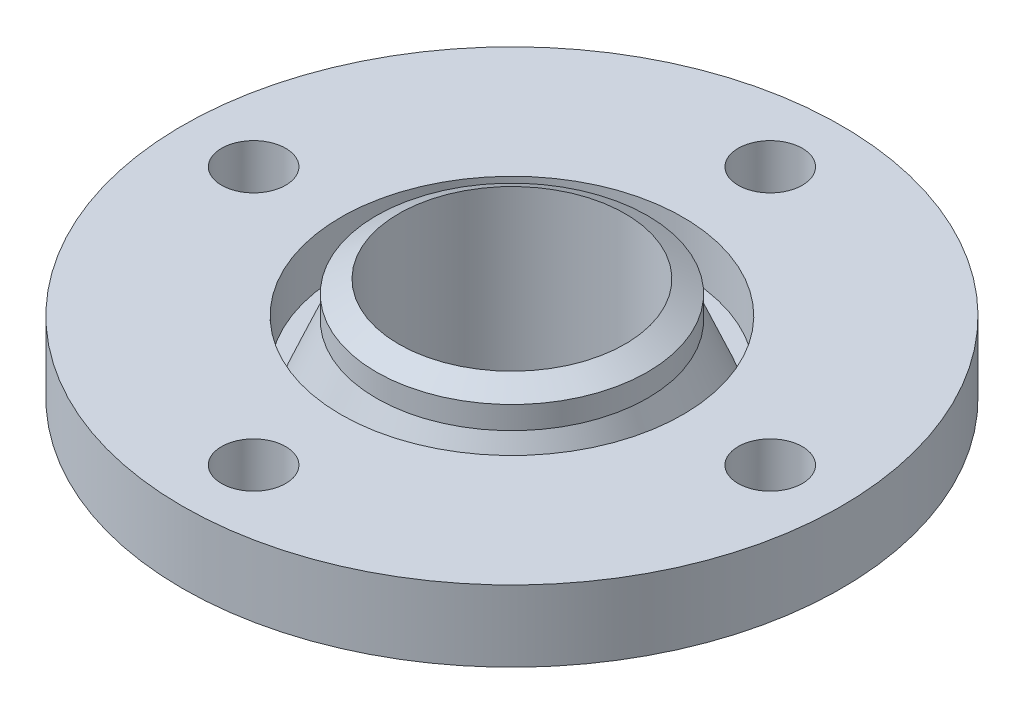
ISO-10303-21;
HEADER;
FILE_DESCRIPTION(('STEP AP214'),'2;1');
FILE_NAME('part.step','',(''),(''),'','','');
FILE_SCHEMA(('AUTOMOTIVE_DESIGN { 1 0 10303 214 1 1 1 1 }'));
ENDSEC;
DATA;
#1=APPLICATION_CONTEXT('core data for automotive mechanical design processes');
#2=APPLICATION_PROTOCOL_DEFINITION('international standard','automotive_design',2000,#1);
#3=PRODUCT_CONTEXT('',#1,'mechanical');
#4=PRODUCT('Part','Part','',(#3));
#5=PRODUCT_RELATED_PRODUCT_CATEGORY('part','',(#4));
#6=PRODUCT_DEFINITION_FORMATION('','',#4);
#7=PRODUCT_DEFINITION_CONTEXT('part definition',#1,'design');
#8=PRODUCT_DEFINITION('design','',#6,#7);
#9=PRODUCT_DEFINITION_SHAPE('','',#8);
#10=(LENGTH_UNIT() NAMED_UNIT(*) SI_UNIT(.MILLI.,.METRE.));
#11=(NAMED_UNIT(*) PLANE_ANGLE_UNIT() SI_UNIT($,.RADIAN.));
#12=(NAMED_UNIT(*) SI_UNIT($,.STERADIAN.) SOLID_ANGLE_UNIT());
#13=UNCERTAINTY_MEASURE_WITH_UNIT(LENGTH_MEASURE(1.E-05),#10,'distance_accuracy_value','');
#14=(GEOMETRIC_REPRESENTATION_CONTEXT(3) GLOBAL_UNCERTAINTY_ASSIGNED_CONTEXT((#13)) GLOBAL_UNIT_ASSIGNED_CONTEXT((#10,
#11,#12)) REPRESENTATION_CONTEXT('',''));
#15=CARTESIAN_POINT('',(0.,0.,0.));
#16=DIRECTION('',(0.,0.,1.));
#17=DIRECTION('',(1.,0.,0.));
#18=AXIS2_PLACEMENT_3D('',#15,#16,#17);
#19=CARTESIAN_POINT('',(0.,0.,0.));
#20=DIRECTION('',(0.,-1.,0.));
#21=DIRECTION('',(0.,0.,-1.));
#22=AXIS2_PLACEMENT_3D('',#19,#20,#21);
#23=CONICAL_SURFACE('',#22,31.75,1.04719755119659);
#24=CARTESIAN_POINT('',(0.,-3.63730669589472,0.));
#25=DIRECTION('',(0.,1.,0.));
#26=DIRECTION('',(0.,0.,1.));
#27=AXIS2_PLACEMENT_3D('',#24,#25,#26);
#28=CIRCLE('',#27,38.05);
#29=CARTESIAN_POINT('',(0.,-3.63730669589472,38.05));
#30=VERTEX_POINT('',#29);
#31=EDGE_CURVE('E10',#30,#30,#28,.T.);
#32=ORIENTED_EDGE('',*,*,#31,.T.);
#33=EDGE_LOOP('',(#32));
#34=FACE_BOUND('',#33,.T.);
#35=CARTESIAN_POINT('',(0.,0.,0.));
#36=DIRECTION('',(0.,1.,0.));
#37=DIRECTION('',(0.,0.,1.));
#38=AXIS2_PLACEMENT_3D('',#35,#36,#37);
#39=CIRCLE('',#38,31.75);
#40=CARTESIAN_POINT('',(0.,0.,31.75));
#41=VERTEX_POINT('',#40);
#42=EDGE_CURVE('E78',#41,#41,#39,.T.);
#43=ORIENTED_EDGE('',*,*,#42,.F.);
#44=EDGE_LOOP('',(#43));
#45=FACE_BOUND('',#44,.T.);
#46=ADVANCED_FACE('F37',(#34,#45),#23,.T.);
#47=CARTESIAN_POINT('',(0.,0.,0.));
#48=DIRECTION('',(0.,1.,0.));
#49=DIRECTION('',(0.,0.,1.));
#50=AXIS2_PLACEMENT_3D('',#47,#48,#49);
#51=CYLINDRICAL_SURFACE('',#50,38.05);
#52=CARTESIAN_POINT('',(0.,-10.,0.));
#53=DIRECTION('',(0.,1.,0.));
#54=DIRECTION('',(0.,0.,1.));
#55=AXIS2_PLACEMENT_3D('',#52,#53,#54);
#56=CIRCLE('',#55,38.05);
#57=CARTESIAN_POINT('',(0.,-10.,38.05));
#58=VERTEX_POINT('',#57);
#59=EDGE_CURVE('E44',#58,#58,#56,.T.);
#60=ORIENTED_EDGE('',*,*,#59,.T.);
#61=EDGE_LOOP('',(#60));
#62=FACE_BOUND('',#61,.T.);
#63=ORIENTED_EDGE('',*,*,#31,.F.);
#64=EDGE_LOOP('',(#63));
#65=FACE_BOUND('',#64,.T.);
#66=ADVANCED_FACE('F122',(#62,#65),#51,.T.);
#67=CARTESIAN_POINT('',(0.,-10.,0.));
#68=DIRECTION('',(0.,-1.,0.));
#69=DIRECTION('',(0.,0.,-1.));
#70=AXIS2_PLACEMENT_3D('',#67,#68,#69);
#71=CONICAL_SURFACE('',#70,38.05,0.396285049494058);
#72=CARTESIAN_POINT('',(0.,-29.,0.));
#73=DIRECTION('',(0.,1.,0.));
#74=DIRECTION('',(0.,0.,1.));
#75=AXIS2_PLACEMENT_3D('',#72,#73,#74);
#76=CIRCLE('',#75,46.);
#77=CARTESIAN_POINT('',(0.,-29.,46.));
#78=VERTEX_POINT('',#77);
#79=EDGE_CURVE('E49',#78,#78,#76,.T.);
#80=ORIENTED_EDGE('',*,*,#79,.T.);
#81=EDGE_LOOP('',(#80));
#82=FACE_BOUND('',#81,.T.);
#83=ORIENTED_EDGE('',*,*,#59,.F.);
#84=EDGE_LOOP('',(#83));
#85=FACE_BOUND('',#84,.T.);
#86=ADVANCED_FACE('F107',(#82,#85),#71,.T.);
#87=CARTESIAN_POINT('',(-54.,-29.,0.));
#88=DIRECTION('',(0.,1.,0.));
#89=DIRECTION('',(0.,0.,1.));
#90=AXIS2_PLACEMENT_3D('',#87,#88,#89);
#91=PLANE('',#90);
#92=CARTESIAN_POINT('',(0.,-29.,0.));
#93=DIRECTION('',(0.,1.,0.));
#94=DIRECTION('',(0.,0.,1.));
#95=AXIS2_PLACEMENT_3D('',#92,#93,#94);
#96=CIRCLE('',#95,54.);
#97=CARTESIAN_POINT('',(0.,-29.,54.));
#98=VERTEX_POINT('',#97);
#99=EDGE_CURVE('E102',#98,#98,#96,.T.);
#100=ORIENTED_EDGE('',*,*,#99,.T.);
#101=EDGE_LOOP('',(#100));
#102=FACE_BOUND('',#101,.T.);
#103=ORIENTED_EDGE('',*,*,#79,.F.);
#104=EDGE_LOOP('',(#103));
#105=FACE_BOUND('',#104,.T.);
#106=ADVANCED_FACE('F110',(#102,#105),#91,.T.);
#107=CARTESIAN_POINT('',(0.,-29.,0.));
#108=DIRECTION('',(0.,-1.,0.));
#109=DIRECTION('',(0.,0.,-1.));
#110=AXIS2_PLACEMENT_3D('',#107,#108,#109);
#111=CONICAL_SURFACE('',#110,54.,0.785398163397454);
#112=CARTESIAN_POINT('',(0.,-23.0000000000001,0.));
#113=DIRECTION('',(0.,1.,0.));
#114=DIRECTION('',(0.,0.,1.));
#115=AXIS2_PLACEMENT_3D('',#112,#113,#114);
#116=CIRCLE('',#115,48.);
#117=CARTESIAN_POINT('',(0.,-23.0000000000001,48.));
#118=VERTEX_POINT('',#117);
#119=EDGE_CURVE('E99',#118,#118,#116,.T.);
#120=ORIENTED_EDGE('',*,*,#119,.T.);
#121=EDGE_LOOP('',(#120));
#122=FACE_BOUND('',#121,.T.);
#123=ORIENTED_EDGE('',*,*,#99,.F.);
#124=EDGE_LOOP('',(#123));
#125=FACE_BOUND('',#124,.T.);
#126=ADVANCED_FACE('F112',(#122,#125),#111,.F.);
#127=CARTESIAN_POINT('',(0.,0.,0.));
#128=DIRECTION('',(0.,1.,0.));
#129=DIRECTION('',(0.,0.,1.));
#130=AXIS2_PLACEMENT_3D('',#127,#128,#129);
#131=CYLINDRICAL_SURFACE('',#130,48.);
#132=CARTESIAN_POINT('',(0.,-9.,0.));
#133=DIRECTION('',(0.,1.,0.));
#134=DIRECTION('',(0.,0.,1.));
#135=AXIS2_PLACEMENT_3D('',#132,#133,#134);
#136=CIRCLE('',#135,48.);
#137=CARTESIAN_POINT('',(0.,-9.,48.));
#138=VERTEX_POINT('',#137);
#139=EDGE_CURVE('E96',#138,#138,#136,.T.);
#140=ORIENTED_EDGE('',*,*,#139,.T.);
#141=EDGE_LOOP('',(#140));
#142=FACE_BOUND('',#141,.T.);
#143=ORIENTED_EDGE('',*,*,#119,.F.);
#144=EDGE_LOOP('',(#143));
#145=FACE_BOUND('',#144,.T.);
#146=ADVANCED_FACE('F119',(#142,#145),#131,.F.);
#147=CARTESIAN_POINT('',(-92.5,-9.,0.));
#148=DIRECTION('',(0.,1.,0.));
#149=DIRECTION('',(0.,0.,1.));
#150=AXIS2_PLACEMENT_3D('',#147,#148,#149);
#151=PLANE('',#150);
#152=CARTESIAN_POINT('',(-7.59397191198381E-13,-9.,72.5));
#153=DIRECTION('',(0.,1.,0.));
#154=DIRECTION('',(0.,0.,1.));
#155=AXIS2_PLACEMENT_3D('',#152,#153,#154);
#156=CIRCLE('',#155,8.99999999999999);
#157=CARTESIAN_POINT('',(-7.59397191198381E-13,-9.,81.5));
#158=VERTEX_POINT('',#157);
#159=EDGE_CURVE('E63',#158,#158,#156,.T.);
#160=ORIENTED_EDGE('',*,*,#159,.F.);
#161=EDGE_LOOP('',(#160));
#162=FACE_BOUND('',#161,.T.);
#163=CARTESIAN_POINT('',(72.5,-9.,5.06264794132254E-13));
#164=DIRECTION('',(0.,1.,0.));
#165=DIRECTION('',(0.,0.,1.));
#166=AXIS2_PLACEMENT_3D('',#163,#164,#165);
#167=CIRCLE('',#166,8.99999999999999);
#168=CARTESIAN_POINT('',(72.5,-9.,9.0000000000005));
#169=VERTEX_POINT('',#168);
#170=EDGE_CURVE('E60',#169,#169,#167,.T.);
#171=ORIENTED_EDGE('',*,*,#170,.F.);
#172=EDGE_LOOP('',(#171));
#173=FACE_BOUND('',#172,.T.);
#174=CARTESIAN_POINT('',(2.53132397066127E-13,-9.,-72.5));
#175=DIRECTION('',(0.,1.,0.));
#176=DIRECTION('',(0.,0.,1.));
#177=AXIS2_PLACEMENT_3D('',#174,#175,#176);
#178=CIRCLE('',#177,8.99999999999999);
#179=CARTESIAN_POINT('',(2.53132397066127E-13,-9.,-63.5));
#180=VERTEX_POINT('',#179);
#181=EDGE_CURVE('E57',#180,#180,#178,.T.);
#182=ORIENTED_EDGE('',*,*,#181,.F.);
#183=EDGE_LOOP('',(#182));
#184=FACE_BOUND('',#183,.T.);
#185=CARTESIAN_POINT('',(-72.5,-9.,0.));
#186=DIRECTION('',(0.,1.,0.));
#187=DIRECTION('',(0.,0.,1.));
#188=AXIS2_PLACEMENT_3D('',#185,#186,#187);
#189=CIRCLE('',#188,8.99999999999999);
#190=CARTESIAN_POINT('',(-72.5,-9.,8.99999999999999));
#191=VERTEX_POINT('',#190);
#192=EDGE_CURVE('E56',#191,#191,#189,.T.);
#193=ORIENTED_EDGE('',*,*,#192,.F.);
#194=EDGE_LOOP('',(#193));
#195=FACE_BOUND('',#194,.T.);
#196=CARTESIAN_POINT('',(0.,-9.,0.));
#197=DIRECTION('',(0.,1.,0.));
#198=DIRECTION('',(0.,0.,1.));
#199=AXIS2_PLACEMENT_3D('',#196,#197,#198);
#200=CIRCLE('',#199,92.5);
#201=CARTESIAN_POINT('',(0.,-9.,92.5));
#202=VERTEX_POINT('',#201);
#203=EDGE_CURVE('E93',#202,#202,#200,.T.);
#204=ORIENTED_EDGE('',*,*,#203,.T.);
#205=EDGE_LOOP('',(#204));
#206=FACE_BOUND('',#205,.T.);
#207=ORIENTED_EDGE('',*,*,#139,.F.);
#208=EDGE_LOOP('',(#207));
#209=FACE_BOUND('',#208,.T.);
#210=ADVANCED_FACE('F161',(#162,#173,#184,#195,#206,#209),#151,.T.);
#211=CARTESIAN_POINT('',(0.,0.,0.));
#212=DIRECTION('',(0.,1.,0.));
#213=DIRECTION('',(0.,0.,1.));
#214=AXIS2_PLACEMENT_3D('',#211,#212,#213);
#215=CYLINDRICAL_SURFACE('',#214,92.5);
#216=CARTESIAN_POINT('',(0.,-29.,0.));
#217=DIRECTION('',(0.,1.,0.));
#218=DIRECTION('',(0.,0.,1.));
#219=AXIS2_PLACEMENT_3D('',#216,#217,#218);
#220=CIRCLE('',#219,92.5);
#221=CARTESIAN_POINT('',(0.,-29.,92.5));
#222=VERTEX_POINT('',#221);
#223=EDGE_CURVE('E90',#222,#222,#220,.T.);
#224=ORIENTED_EDGE('',*,*,#223,.T.);
#225=EDGE_LOOP('',(#224));
#226=FACE_BOUND('',#225,.T.);
#227=ORIENTED_EDGE('',*,*,#203,.F.);
#228=EDGE_LOOP('',(#227));
#229=FACE_BOUND('',#228,.T.);
#230=ADVANCED_FACE('F154',(#226,#229),#215,.T.);
#231=CARTESIAN_POINT('',(-59.,-29.,0.));
#232=DIRECTION('',(0.,-1.,0.));
#233=DIRECTION('',(0.,0.,-1.));
#234=AXIS2_PLACEMENT_3D('',#231,#232,#233);
#235=PLANE('',#234);
#236=CARTESIAN_POINT('',(-7.59397191198381E-13,-29.,72.5));
#237=DIRECTION('',(0.,-1.,0.));
#238=DIRECTION('',(0.,0.,-1.));
#239=AXIS2_PLACEMENT_3D('',#236,#237,#238);
#240=CIRCLE('',#239,8.99999999999999);
#241=CARTESIAN_POINT('',(-7.59397191198381E-13,-29.,63.5));
#242=VERTEX_POINT('',#241);
#243=EDGE_CURVE('E40',#242,#242,#240,.T.);
#244=ORIENTED_EDGE('',*,*,#243,.F.);
#245=EDGE_LOOP('',(#244));
#246=FACE_BOUND('',#245,.T.);
#247=CARTESIAN_POINT('',(72.5,-29.,5.06264794132254E-13));
#248=DIRECTION('',(0.,-1.,0.));
#249=DIRECTION('',(0.,0.,-1.));
#250=AXIS2_PLACEMENT_3D('',#247,#248,#249);
#251=CIRCLE('',#250,8.99999999999999);
#252=CARTESIAN_POINT('',(72.5,-29.,-8.99999999999949));
#253=VERTEX_POINT('',#252);
#254=EDGE_CURVE('E61',#253,#253,#251,.T.);
#255=ORIENTED_EDGE('',*,*,#254,.F.);
#256=EDGE_LOOP('',(#255));
#257=FACE_BOUND('',#256,.T.);
#258=CARTESIAN_POINT('',(2.53132397066127E-13,-29.,-72.5));
#259=DIRECTION('',(0.,-1.,0.));
#260=DIRECTION('',(0.,0.,-1.));
#261=AXIS2_PLACEMENT_3D('',#258,#259,#260);
#262=CIRCLE('',#261,8.99999999999999);
#263=CARTESIAN_POINT('',(2.53132397066127E-13,-29.,-81.5));
#264=VERTEX_POINT('',#263);
#265=EDGE_CURVE('E58',#264,#264,#262,.T.);
#266=ORIENTED_EDGE('',*,*,#265,.F.);
#267=EDGE_LOOP('',(#266));
#268=FACE_BOUND('',#267,.T.);
#269=CARTESIAN_POINT('',(-72.5,-29.,0.));
#270=DIRECTION('',(0.,-1.,0.));
#271=DIRECTION('',(0.,0.,-1.));
#272=AXIS2_PLACEMENT_3D('',#269,#270,#271);
#273=CIRCLE('',#272,8.99999999999999);
#274=CARTESIAN_POINT('',(-72.5,-29.,-8.99999999999999));
#275=VERTEX_POINT('',#274);
#276=EDGE_CURVE('E53',#275,#275,#273,.T.);
#277=ORIENTED_EDGE('',*,*,#276,.F.);
#278=EDGE_LOOP('',(#277));
#279=FACE_BOUND('',#278,.T.);
#280=CARTESIAN_POINT('',(0.,-29.,0.));
#281=DIRECTION('',(0.,1.,0.));
#282=DIRECTION('',(0.,0.,1.));
#283=AXIS2_PLACEMENT_3D('',#280,#281,#282);
#284=CIRCLE('',#283,59.);
#285=CARTESIAN_POINT('',(0.,-29.,59.));
#286=VERTEX_POINT('',#285);
#287=EDGE_CURVE('E87',#286,#286,#284,.T.);
#288=ORIENTED_EDGE('',*,*,#287,.T.);
#289=EDGE_LOOP('',(#288));
#290=FACE_BOUND('',#289,.T.);
#291=ORIENTED_EDGE('',*,*,#223,.F.);
#292=EDGE_LOOP('',(#291));
#293=FACE_BOUND('',#292,.T.);
#294=ADVANCED_FACE('F148',(#246,#257,#268,#279,#290,#293),#235,.T.);
#295=CARTESIAN_POINT('',(0.,0.,0.));
#296=DIRECTION('',(0.,1.,0.));
#297=DIRECTION('',(0.,0.,1.));
#298=AXIS2_PLACEMENT_3D('',#295,#296,#297);
#299=CYLINDRICAL_SURFACE('',#298,59.);
#300=CARTESIAN_POINT('',(0.,-45.,0.));
#301=DIRECTION('',(0.,1.,0.));
#302=DIRECTION('',(0.,0.,1.));
#303=AXIS2_PLACEMENT_3D('',#300,#301,#302);
#304=CIRCLE('',#303,59.);
#305=CARTESIAN_POINT('',(0.,-45.,59.));
#306=VERTEX_POINT('',#305);
#307=EDGE_CURVE('E84',#306,#306,#304,.T.);
#308=ORIENTED_EDGE('',*,*,#307,.T.);
#309=EDGE_LOOP('',(#308));
#310=FACE_BOUND('',#309,.T.);
#311=ORIENTED_EDGE('',*,*,#287,.F.);
#312=EDGE_LOOP('',(#311));
#313=FACE_BOUND('',#312,.T.);
#314=ADVANCED_FACE('F142',(#310,#313),#299,.T.);
#315=CARTESIAN_POINT('',(-31.75,-45.,0.));
#316=DIRECTION('',(0.,-1.,0.));
#317=DIRECTION('',(0.,0.,-1.));
#318=AXIS2_PLACEMENT_3D('',#315,#316,#317);
#319=PLANE('',#318);
#320=CARTESIAN_POINT('',(0.,-45.,0.));
#321=DIRECTION('',(0.,1.,0.));
#322=DIRECTION('',(0.,0.,1.));
#323=AXIS2_PLACEMENT_3D('',#320,#321,#322);
#324=CIRCLE('',#323,31.75);
#325=CARTESIAN_POINT('',(0.,-45.,31.75));
#326=VERTEX_POINT('',#325);
#327=EDGE_CURVE('E81',#326,#326,#324,.T.);
#328=ORIENTED_EDGE('',*,*,#327,.T.);
#329=EDGE_LOOP('',(#328));
#330=FACE_BOUND('',#329,.T.);
#331=ORIENTED_EDGE('',*,*,#307,.F.);
#332=EDGE_LOOP('',(#331));
#333=FACE_BOUND('',#332,.T.);
#334=ADVANCED_FACE('F136',(#330,#333),#319,.T.);
#335=CARTESIAN_POINT('',(0.,0.,0.));
#336=DIRECTION('',(0.,1.,0.));
#337=DIRECTION('',(0.,0.,1.));
#338=AXIS2_PLACEMENT_3D('',#335,#336,#337);
#339=CYLINDRICAL_SURFACE('',#338,31.75);
#340=ORIENTED_EDGE('',*,*,#42,.T.);
#341=EDGE_LOOP('',(#340));
#342=FACE_BOUND('',#341,.T.);
#343=ORIENTED_EDGE('',*,*,#327,.F.);
#344=EDGE_LOOP('',(#343));
#345=FACE_BOUND('',#344,.T.);
#346=ADVANCED_FACE('F132',(#342,#345),#339,.F.);
#347=CARTESIAN_POINT('',(-72.5,10.8053681211576,0.));
#348=DIRECTION('',(0.,1.,0.));
#349=DIRECTION('',(-1.,0.,0.));
#350=AXIS2_PLACEMENT_3D('',#347,#348,#349);
#351=CYLINDRICAL_SURFACE('',#350,8.99999999999999);
#352=ORIENTED_EDGE('',*,*,#192,.T.);
#353=EDGE_LOOP('',(#352));
#354=FACE_BOUND('',#353,.T.);
#355=ORIENTED_EDGE('',*,*,#276,.T.);
#356=EDGE_LOOP('',(#355));
#357=FACE_BOUND('',#356,.T.);
#358=ADVANCED_FACE('F135',(#354,#357),#351,.F.);
#359=CARTESIAN_POINT('',(2.53132397066127E-13,10.8053681211576,-72.5));
#360=DIRECTION('',(0.,1.,0.));
#361=DIRECTION('',(0.,0.,-1.));
#362=AXIS2_PLACEMENT_3D('',#359,#360,#361);
#363=CYLINDRICAL_SURFACE('',#362,8.99999999999999);
#364=ORIENTED_EDGE('',*,*,#181,.T.);
#365=EDGE_LOOP('',(#364));
#366=FACE_BOUND('',#365,.T.);
#367=ORIENTED_EDGE('',*,*,#265,.T.);
#368=EDGE_LOOP('',(#367));
#369=FACE_BOUND('',#368,.T.);
#370=ADVANCED_FACE('F182',(#366,#369),#363,.F.);
#371=CARTESIAN_POINT('',(72.5,10.8053681211576,5.06264794132254E-13));
#372=DIRECTION('',(0.,1.,0.));
#373=DIRECTION('',(1.,0.,0.));
#374=AXIS2_PLACEMENT_3D('',#371,#372,#373);
#375=CYLINDRICAL_SURFACE('',#374,8.99999999999999);
#376=ORIENTED_EDGE('',*,*,#170,.T.);
#377=EDGE_LOOP('',(#376));
#378=FACE_BOUND('',#377,.T.);
#379=ORIENTED_EDGE('',*,*,#254,.T.);
#380=EDGE_LOOP('',(#379));
#381=FACE_BOUND('',#380,.T.);
#382=ADVANCED_FACE('F186',(#378,#381),#375,.F.);
#383=CARTESIAN_POINT('',(-7.59397191198381E-13,10.8053681211576,72.5));
#384=DIRECTION('',(0.,1.,0.));
#385=DIRECTION('',(0.,0.,1.));
#386=AXIS2_PLACEMENT_3D('',#383,#384,#385);
#387=CYLINDRICAL_SURFACE('',#386,8.99999999999999);
#388=ORIENTED_EDGE('',*,*,#159,.T.);
#389=EDGE_LOOP('',(#388));
#390=FACE_BOUND('',#389,.T.);
#391=ORIENTED_EDGE('',*,*,#243,.T.);
#392=EDGE_LOOP('',(#391));
#393=FACE_BOUND('',#392,.T.);
#394=ADVANCED_FACE('F190',(#390,#393),#387,.F.);
#395=CLOSED_SHELL('',(#46,#66,#86,#106,#126,#146,#210,#230,#294,#314,#334,#346,#358,#370,#382,#394));
#396=MANIFOLD_SOLID_BREP('B2',#395);
#397=ADVANCED_BREP_SHAPE_REPRESENTATION('',(#18,#396),#14);
#398=SHAPE_DEFINITION_REPRESENTATION(#9,#397);
ENDSEC;
END-ISO-10303-21;
